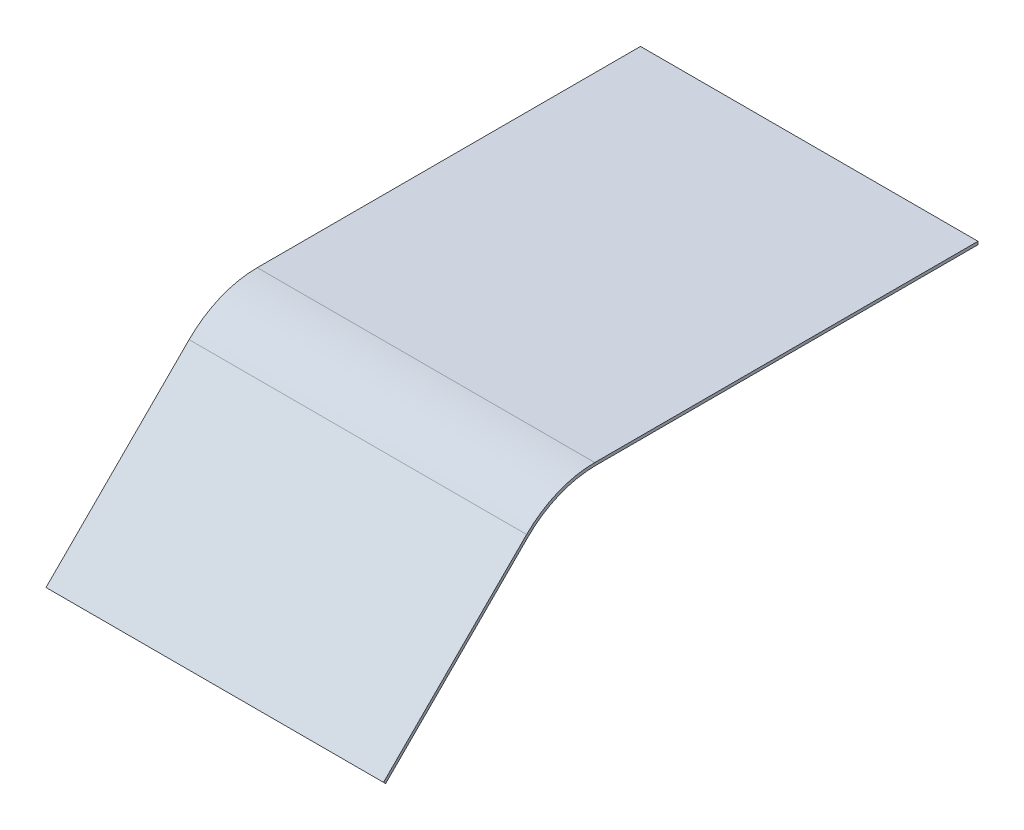
ISO-10303-21;
HEADER;
FILE_DESCRIPTION(('STEP AP214'),'2;1');
FILE_NAME('part.step','',(''),(''),'','','');
FILE_SCHEMA(('AUTOMOTIVE_DESIGN { 1 0 10303 214 1 1 1 1 }'));
ENDSEC;
DATA;
#1=APPLICATION_CONTEXT('core data for automotive mechanical design processes');
#2=APPLICATION_PROTOCOL_DEFINITION('international standard','automotive_design',2000,#1);
#3=PRODUCT_CONTEXT('',#1,'mechanical');
#4=PRODUCT('Part','Part','',(#3));
#5=PRODUCT_RELATED_PRODUCT_CATEGORY('part','',(#4));
#6=PRODUCT_DEFINITION_FORMATION('','',#4);
#7=PRODUCT_DEFINITION_CONTEXT('part definition',#1,'design');
#8=PRODUCT_DEFINITION('design','',#6,#7);
#9=PRODUCT_DEFINITION_SHAPE('','',#8);
#10=(LENGTH_UNIT() NAMED_UNIT(*) SI_UNIT(.MILLI.,.METRE.));
#11=(NAMED_UNIT(*) PLANE_ANGLE_UNIT() SI_UNIT($,.RADIAN.));
#12=(NAMED_UNIT(*) SI_UNIT($,.STERADIAN.) SOLID_ANGLE_UNIT());
#13=UNCERTAINTY_MEASURE_WITH_UNIT(LENGTH_MEASURE(1.E-05),#10,'distance_accuracy_value','');
#14=(GEOMETRIC_REPRESENTATION_CONTEXT(3) GLOBAL_UNCERTAINTY_ASSIGNED_CONTEXT((#13)) GLOBAL_UNIT_ASSIGNED_CONTEXT((#10,
#11,#12)) REPRESENTATION_CONTEXT('',''));
#15=CARTESIAN_POINT('',(0.,0.,0.));
#16=DIRECTION('',(0.,0.,1.));
#17=DIRECTION('',(1.,0.,0.));
#18=AXIS2_PLACEMENT_3D('',#15,#16,#17);
#19=CARTESIAN_POINT('',(177.8,0.,-222.25));
#20=DIRECTION('',(0.,0.,1.));
#21=DIRECTION('',(1.,0.,0.));
#22=AXIS2_PLACEMENT_3D('',#19,#20,#21);
#23=PLANE('',#22);
#24=DIRECTION('',(0.,1.,0.));
#25=VECTOR('',#24,1.);
#26=CARTESIAN_POINT('',(0.,0.,-222.25));
#27=LINE('',#26,#25);
#28=CARTESIAN_POINT('',(0.,0.,-222.25));
#29=VERTEX_POINT('',#28);
#30=CARTESIAN_POINT('',(0.,1.5875,-222.25));
#31=VERTEX_POINT('',#30);
#32=EDGE_CURVE('E133',#29,#31,#27,.T.);
#33=ORIENTED_EDGE('',*,*,#32,.T.);
#34=DIRECTION('',(-1.,0.,0.));
#35=VECTOR('',#34,1.);
#36=CARTESIAN_POINT('',(177.8,1.5875,-222.25));
#37=LINE('',#36,#35);
#38=CARTESIAN_POINT('',(177.8,1.5875,-222.25));
#39=VERTEX_POINT('',#38);
#40=EDGE_CURVE('E11',#39,#31,#37,.T.);
#41=ORIENTED_EDGE('',*,*,#40,.F.);
#42=DIRECTION('',(0.,1.,0.));
#43=VECTOR('',#42,1.);
#44=CARTESIAN_POINT('',(177.8,0.,-222.25));
#45=LINE('',#44,#43);
#46=CARTESIAN_POINT('',(177.8,0.,-222.25));
#47=VERTEX_POINT('',#46);
#48=EDGE_CURVE('E147',#47,#39,#45,.T.);
#49=ORIENTED_EDGE('',*,*,#48,.F.);
#50=DIRECTION('',(-1.,0.,0.));
#51=VECTOR('',#50,1.);
#52=CARTESIAN_POINT('',(177.8,0.,-222.25));
#53=LINE('',#52,#51);
#54=EDGE_CURVE('E129',#47,#29,#53,.T.);
#55=ORIENTED_EDGE('',*,*,#54,.T.);
#56=EDGE_LOOP('',(#33,#41,#49,#55));
#57=FACE_BOUND('',#56,.T.);
#58=ADVANCED_FACE('F37',(#57),#23,.F.);
#59=CARTESIAN_POINT('',(177.8,1.5875,-222.25));
#60=DIRECTION('',(0.,-1.,0.));
#61=DIRECTION('',(0.,0.,-1.));
#62=AXIS2_PLACEMENT_3D('',#59,#60,#61);
#63=PLANE('',#62);
#64=DIRECTION('',(0.,0.,1.));
#65=VECTOR('',#64,1.);
#66=CARTESIAN_POINT('',(0.,1.5875,-222.25));
#67=LINE('',#66,#65);
#68=CARTESIAN_POINT('',(0.,1.58749999999997,-20.3844849382859));
#69=VERTEX_POINT('',#68);
#70=EDGE_CURVE('E136',#31,#69,#67,.T.);
#71=ORIENTED_EDGE('',*,*,#70,.T.);
#72=DIRECTION('',(-1.,0.,0.));
#73=VECTOR('',#72,1.);
#74=CARTESIAN_POINT('',(177.8,1.58749999999997,-20.3844849382859));
#75=LINE('',#74,#73);
#76=CARTESIAN_POINT('',(177.8,1.58749999999997,-20.3844849382859));
#77=VERTEX_POINT('',#76);
#78=EDGE_CURVE('E45',#77,#69,#75,.T.);
#79=ORIENTED_EDGE('',*,*,#78,.F.);
#80=DIRECTION('',(0.,0.,1.));
#81=VECTOR('',#80,1.);
#82=CARTESIAN_POINT('',(177.8,1.5875,-222.25));
#83=LINE('',#82,#81);
#84=EDGE_CURVE('E96',#39,#77,#83,.T.);
#85=ORIENTED_EDGE('',*,*,#84,.F.);
#86=ORIENTED_EDGE('',*,*,#40,.T.);
#87=EDGE_LOOP('',(#71,#79,#85,#86));
#88=FACE_BOUND('',#87,.T.);
#89=ADVANCED_FACE('F184',(#88),#63,.F.);
#90=CARTESIAN_POINT('',(177.8,-49.2125,-20.384484938286));
#91=DIRECTION('',(-1.,0.,0.));
#92=DIRECTION('',(0.,0.,1.));
#93=AXIS2_PLACEMENT_3D('',#90,#91,#92);
#94=CYLINDRICAL_SURFACE('',#93,50.8);
#95=CARTESIAN_POINT('',(0.,-49.2125,-20.384484938286));
#96=DIRECTION('',(1.,0.,0.));
#97=DIRECTION('',(0.,0.,-1.));
#98=AXIS2_PLACEMENT_3D('',#95,#96,#97);
#99=CIRCLE('',#98,50.8);
#100=CARTESIAN_POINT('',(0.,-13.2914755157235,15.5365395459907));
#101=VERTEX_POINT('',#100);
#102=EDGE_CURVE('E138',#69,#101,#99,.T.);
#103=ORIENTED_EDGE('',*,*,#102,.T.);
#104=DIRECTION('',(-1.,0.,0.));
#105=VECTOR('',#104,1.);
#106=CARTESIAN_POINT('',(177.8,-13.2914755157235,15.5365395459907));
#107=LINE('',#106,#105);
#108=CARTESIAN_POINT('',(177.8,-13.2914755157235,15.5365395459907));
#109=VERTEX_POINT('',#108);
#110=EDGE_CURVE('E156',#109,#101,#107,.T.);
#111=ORIENTED_EDGE('',*,*,#110,.F.);
#112=CARTESIAN_POINT('',(177.8,-49.2125,-20.384484938286));
#113=DIRECTION('',(1.,0.,0.));
#114=DIRECTION('',(0.,0.,-1.));
#115=AXIS2_PLACEMENT_3D('',#112,#113,#114);
#116=CIRCLE('',#115,50.8);
#117=EDGE_CURVE('E164',#77,#109,#116,.T.);
#118=ORIENTED_EDGE('',*,*,#117,.F.);
#119=ORIENTED_EDGE('',*,*,#78,.T.);
#120=EDGE_LOOP('',(#103,#111,#118,#119));
#121=FACE_BOUND('',#120,.T.);
#122=ADVANCED_FACE('F162',(#121),#94,.T.);
#123=CARTESIAN_POINT('',(177.8,-13.2914755157235,15.5365395459907));
#124=DIRECTION('',(0.,-0.707106781186546,-0.707106781186549));
#125=DIRECTION('',(0.,0.707106781186549,-0.707106781186546));
#126=AXIS2_PLACEMENT_3D('',#123,#124,#125);
#127=PLANE('',#126);
#128=DIRECTION('',(0.,-0.707106781186549,0.707106781186546));
#129=VECTOR('',#128,1.);
#130=CARTESIAN_POINT('',(0.,-13.2914755157235,15.5365395459907));
#131=LINE('',#130,#129);
#132=CARTESIAN_POINT('',(0.,-88.6800291955581,90.925093225825));
#133=VERTEX_POINT('',#132);
#134=EDGE_CURVE('E140',#101,#133,#131,.T.);
#135=ORIENTED_EDGE('',*,*,#134,.T.);
#136=DIRECTION('',(-1.,0.,0.));
#137=VECTOR('',#136,1.);
#138=CARTESIAN_POINT('',(177.8,-88.6800291955581,90.925093225825));
#139=LINE('',#138,#137);
#140=CARTESIAN_POINT('',(177.8,-88.6800291955581,90.925093225825));
#141=VERTEX_POINT('',#140);
#142=EDGE_CURVE('E152',#141,#133,#139,.T.);
#143=ORIENTED_EDGE('',*,*,#142,.F.);
#144=DIRECTION('',(0.,-0.707106781186549,0.707106781186546));
#145=VECTOR('',#144,1.);
#146=CARTESIAN_POINT('',(177.8,-13.2914755157235,15.5365395459907));
#147=LINE('',#146,#145);
#148=EDGE_CURVE('E176',#109,#141,#147,.T.);
#149=ORIENTED_EDGE('',*,*,#148,.F.);
#150=ORIENTED_EDGE('',*,*,#110,.T.);
#151=EDGE_LOOP('',(#135,#143,#149,#150));
#152=FACE_BOUND('',#151,.T.);
#153=ADVANCED_FACE('F172',(#152),#127,.F.);
#154=CARTESIAN_POINT('',(177.8,-88.6800291955581,90.925093225825));
#155=DIRECTION('',(0.,0.707106781186547,-0.707106781186547));
#156=DIRECTION('',(0.,0.707106781186548,0.707106781186548));
#157=AXIS2_PLACEMENT_3D('',#154,#155,#156);
#158=PLANE('',#157);
#159=DIRECTION('',(0.,-0.707106781186547,-0.707106781186547));
#160=VECTOR('',#159,1.);
#161=CARTESIAN_POINT('',(0.,-88.6800291955581,90.925093225825));
#162=LINE('',#161,#160);
#163=CARTESIAN_POINT('',(0.,-89.8025612106917,89.8025612106914));
#164=VERTEX_POINT('',#163);
#165=EDGE_CURVE('E142',#133,#164,#162,.T.);
#166=ORIENTED_EDGE('',*,*,#165,.T.);
#167=DIRECTION('',(-1.,0.,0.));
#168=VECTOR('',#167,1.);
#169=CARTESIAN_POINT('',(177.8,-89.8025612106917,89.8025612106914));
#170=LINE('',#169,#168);
#171=CARTESIAN_POINT('',(177.8,-89.8025612106917,89.8025612106914));
#172=VERTEX_POINT('',#171);
#173=EDGE_CURVE('E124',#172,#164,#170,.T.);
#174=ORIENTED_EDGE('',*,*,#173,.F.);
#175=DIRECTION('',(0.,-0.707106781186547,-0.707106781186547));
#176=VECTOR('',#175,1.);
#177=CARTESIAN_POINT('',(177.8,-88.6800291955581,90.925093225825));
#178=LINE('',#177,#176);
#179=EDGE_CURVE('E115',#141,#172,#178,.T.);
#180=ORIENTED_EDGE('',*,*,#179,.F.);
#181=ORIENTED_EDGE('',*,*,#142,.T.);
#182=EDGE_LOOP('',(#166,#174,#180,#181));
#183=FACE_BOUND('',#182,.T.);
#184=ADVANCED_FACE('F175',(#183),#158,.F.);
#185=CARTESIAN_POINT('',(177.8,-89.8025612106917,89.8025612106914));
#186=DIRECTION('',(0.,0.707106781186546,0.707106781186549));
#187=DIRECTION('',(0.,-0.707106781186549,0.707106781186546));
#188=AXIS2_PLACEMENT_3D('',#185,#186,#187);
#189=PLANE('',#188);
#190=DIRECTION('',(0.,0.707106781186549,-0.707106781186546));
#191=VECTOR('',#190,1.);
#192=CARTESIAN_POINT('',(0.,-89.8025612106917,89.8025612106914));
#193=LINE('',#192,#191);
#194=CARTESIAN_POINT('',(0.,-14.8789755157235,14.8789755157234));
#195=VERTEX_POINT('',#194);
#196=EDGE_CURVE('E123',#164,#195,#193,.T.);
#197=ORIENTED_EDGE('',*,*,#196,.T.);
#198=DIRECTION('',(-1.,0.,0.));
#199=VECTOR('',#198,1.);
#200=CARTESIAN_POINT('',(177.8,-14.8789755157235,14.8789755157234));
#201=LINE('',#200,#199);
#202=CARTESIAN_POINT('',(177.8,-14.8789755157235,14.8789755157234));
#203=VERTEX_POINT('',#202);
#204=EDGE_CURVE('E120',#203,#195,#201,.T.);
#205=ORIENTED_EDGE('',*,*,#204,.F.);
#206=DIRECTION('',(0.,0.707106781186549,-0.707106781186546));
#207=VECTOR('',#206,1.);
#208=CARTESIAN_POINT('',(177.8,-89.8025612106917,89.8025612106914));
#209=LINE('',#208,#207);
#210=EDGE_CURVE('E109',#172,#203,#209,.T.);
#211=ORIENTED_EDGE('',*,*,#210,.F.);
#212=ORIENTED_EDGE('',*,*,#173,.T.);
#213=EDGE_LOOP('',(#197,#205,#211,#212));
#214=FACE_BOUND('',#213,.T.);
#215=ADVANCED_FACE('F121',(#214),#189,.F.);
#216=CARTESIAN_POINT('',(177.8,-50.8,-21.0420489685533));
#217=DIRECTION('',(-1.,0.,0.));
#218=DIRECTION('',(0.,0.,1.));
#219=AXIS2_PLACEMENT_3D('',#216,#217,#218);
#220=CYLINDRICAL_SURFACE('',#219,50.8);
#221=CARTESIAN_POINT('',(0.,-50.8,-21.0420489685533));
#222=DIRECTION('',(-1.,0.,0.));
#223=DIRECTION('',(0.,0.,-1.));
#224=AXIS2_PLACEMENT_3D('',#221,#222,#223);
#225=CIRCLE('',#224,50.8);
#226=CARTESIAN_POINT('',(0.,0.,-21.0420489685533));
#227=VERTEX_POINT('',#226);
#228=EDGE_CURVE('E82',#195,#227,#225,.T.);
#229=ORIENTED_EDGE('',*,*,#228,.T.);
#230=DIRECTION('',(-1.,0.,0.));
#231=VECTOR('',#230,1.);
#232=CARTESIAN_POINT('',(177.8,0.,-21.0420489685533));
#233=LINE('',#232,#231);
#234=CARTESIAN_POINT('',(177.8,0.,-21.0420489685533));
#235=VERTEX_POINT('',#234);
#236=EDGE_CURVE('E125',#235,#227,#233,.T.);
#237=ORIENTED_EDGE('',*,*,#236,.F.);
#238=CARTESIAN_POINT('',(177.8,-50.8,-21.0420489685533));
#239=DIRECTION('',(-1.,0.,0.));
#240=DIRECTION('',(0.,0.,-1.));
#241=AXIS2_PLACEMENT_3D('',#238,#239,#240);
#242=CIRCLE('',#241,50.8);
#243=EDGE_CURVE('E113',#203,#235,#242,.T.);
#244=ORIENTED_EDGE('',*,*,#243,.F.);
#245=ORIENTED_EDGE('',*,*,#204,.T.);
#246=EDGE_LOOP('',(#229,#237,#244,#245));
#247=FACE_BOUND('',#246,.T.);
#248=ADVANCED_FACE('F127',(#247),#220,.F.);
#249=CARTESIAN_POINT('',(177.8,0.,-21.0420489685533));
#250=DIRECTION('',(0.,1.,0.));
#251=DIRECTION('',(0.,0.,1.));
#252=AXIS2_PLACEMENT_3D('',#249,#250,#251);
#253=PLANE('',#252);
#254=DIRECTION('',(0.,0.,-1.));
#255=VECTOR('',#254,1.);
#256=CARTESIAN_POINT('',(0.,0.,-21.0420489685533));
#257=LINE('',#256,#255);
#258=EDGE_CURVE('E88',#227,#29,#257,.T.);
#259=ORIENTED_EDGE('',*,*,#258,.T.);
#260=ORIENTED_EDGE('',*,*,#54,.F.);
#261=DIRECTION('',(0.,0.,-1.));
#262=VECTOR('',#261,1.);
#263=CARTESIAN_POINT('',(177.8,0.,-21.0420489685533));
#264=LINE('',#263,#262);
#265=EDGE_CURVE('E53',#235,#47,#264,.T.);
#266=ORIENTED_EDGE('',*,*,#265,.F.);
#267=ORIENTED_EDGE('',*,*,#236,.T.);
#268=EDGE_LOOP('',(#259,#260,#266,#267));
#269=FACE_BOUND('',#268,.T.);
#270=ADVANCED_FACE('F200',(#269),#253,.F.);
#271=CARTESIAN_POINT('',(177.8,-49.2125,-20.384484938286));
#272=DIRECTION('',(1.,0.,0.));
#273=DIRECTION('',(0.,0.,-1.));
#274=AXIS2_PLACEMENT_3D('',#271,#272,#273);
#275=PLANE('',#274);
#276=ORIENTED_EDGE('',*,*,#48,.T.);
#277=ORIENTED_EDGE('',*,*,#84,.T.);
#278=ORIENTED_EDGE('',*,*,#117,.T.);
#279=ORIENTED_EDGE('',*,*,#148,.T.);
#280=ORIENTED_EDGE('',*,*,#179,.T.);
#281=ORIENTED_EDGE('',*,*,#210,.T.);
#282=ORIENTED_EDGE('',*,*,#243,.T.);
#283=ORIENTED_EDGE('',*,*,#265,.T.);
#284=EDGE_LOOP('',(#276,#277,#278,#279,#280,#281,#282,#283));
#285=FACE_BOUND('',#284,.T.);
#286=ADVANCED_FACE('F111',(#285),#275,.T.);
#287=CARTESIAN_POINT('',(0.,-49.2125,-20.384484938286));
#288=DIRECTION('',(1.,0.,0.));
#289=DIRECTION('',(0.,0.,-1.));
#290=AXIS2_PLACEMENT_3D('',#287,#288,#289);
#291=PLANE('',#290);
#292=ORIENTED_EDGE('',*,*,#32,.F.);
#293=ORIENTED_EDGE('',*,*,#258,.F.);
#294=ORIENTED_EDGE('',*,*,#228,.F.);
#295=ORIENTED_EDGE('',*,*,#196,.F.);
#296=ORIENTED_EDGE('',*,*,#165,.F.);
#297=ORIENTED_EDGE('',*,*,#134,.F.);
#298=ORIENTED_EDGE('',*,*,#102,.F.);
#299=ORIENTED_EDGE('',*,*,#70,.F.);
#300=EDGE_LOOP('',(#292,#293,#294,#295,#296,#297,#298,#299));
#301=FACE_BOUND('',#300,.T.);
#302=ADVANCED_FACE('F168',(#301),#291,.F.);
#303=CLOSED_SHELL('',(#58,#89,#122,#153,#184,#215,#248,#270,#286,#302));
#304=MANIFOLD_SOLID_BREP('B2',#303);
#305=ADVANCED_BREP_SHAPE_REPRESENTATION('',(#18,#304),#14);
#306=SHAPE_DEFINITION_REPRESENTATION(#9,#305);
ENDSEC;
END-ISO-10303-21;
